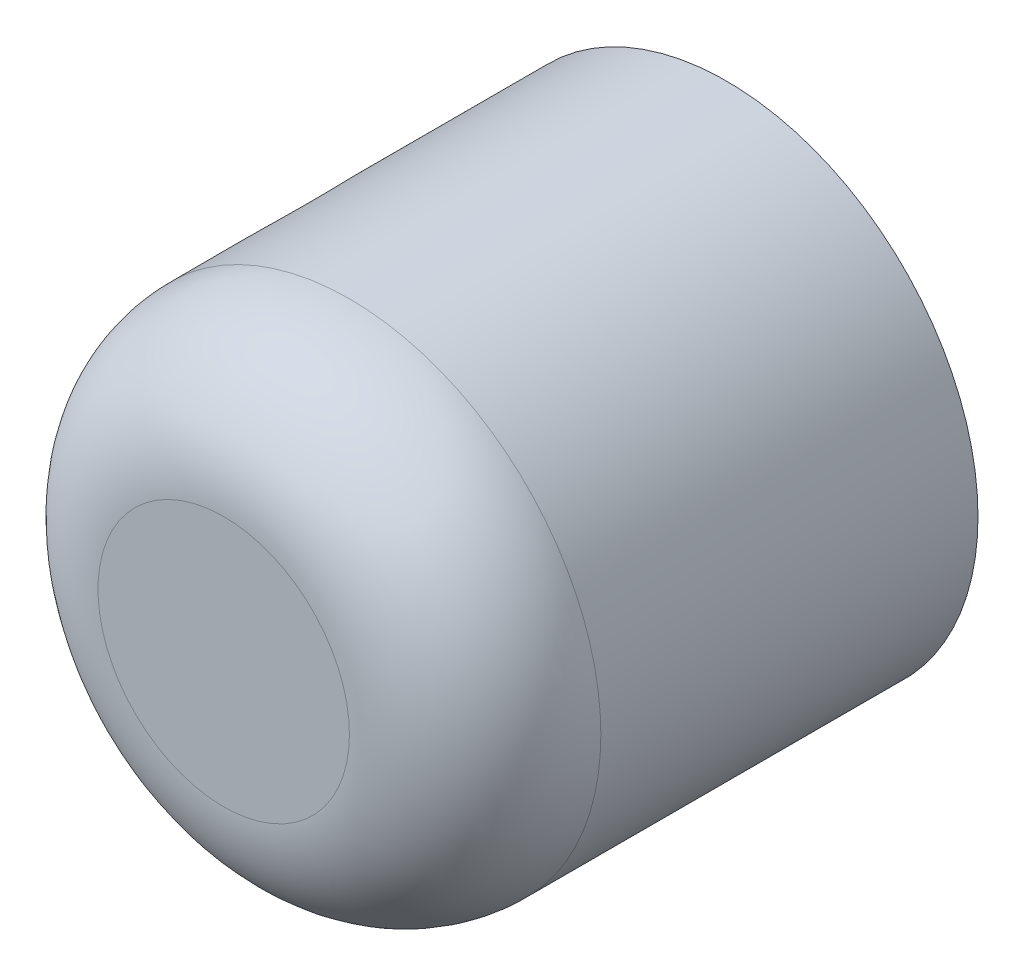
ISO-10303-21;
HEADER;
FILE_DESCRIPTION(('STEP AP214'),'2;1');
FILE_NAME('part.step','',(''),(''),'','','');
FILE_SCHEMA(('AUTOMOTIVE_DESIGN { 1 0 10303 214 1 1 1 1 }'));
ENDSEC;
DATA;
#1=APPLICATION_CONTEXT('core data for automotive mechanical design processes');
#2=APPLICATION_PROTOCOL_DEFINITION('international standard','automotive_design',2000,#1);
#3=PRODUCT_CONTEXT('',#1,'mechanical');
#4=PRODUCT('Part','Part','',(#3));
#5=PRODUCT_RELATED_PRODUCT_CATEGORY('part','',(#4));
#6=PRODUCT_DEFINITION_FORMATION('','',#4);
#7=PRODUCT_DEFINITION_CONTEXT('part definition',#1,'design');
#8=PRODUCT_DEFINITION('design','',#6,#7);
#9=PRODUCT_DEFINITION_SHAPE('','',#8);
#10=(LENGTH_UNIT() NAMED_UNIT(*) SI_UNIT(.MILLI.,.METRE.));
#11=(NAMED_UNIT(*) PLANE_ANGLE_UNIT() SI_UNIT($,.RADIAN.));
#12=(NAMED_UNIT(*) SI_UNIT($,.STERADIAN.) SOLID_ANGLE_UNIT());
#13=UNCERTAINTY_MEASURE_WITH_UNIT(LENGTH_MEASURE(1.E-05),#10,'distance_accuracy_value','');
#14=(GEOMETRIC_REPRESENTATION_CONTEXT(3) GLOBAL_UNCERTAINTY_ASSIGNED_CONTEXT((#13)) GLOBAL_UNIT_ASSIGNED_CONTEXT((#10,
#11,#12)) REPRESENTATION_CONTEXT('',''));
#15=CARTESIAN_POINT('',(0.,0.,0.));
#16=DIRECTION('',(0.,0.,1.));
#17=DIRECTION('',(1.,0.,0.));
#18=AXIS2_PLACEMENT_3D('',#15,#16,#17);
#19=CARTESIAN_POINT('',(0.,0.,40.));
#20=DIRECTION('',(0.,0.,-1.));
#21=DIRECTION('',(-1.,0.,0.));
#22=AXIS2_PLACEMENT_3D('',#19,#20,#21);
#23=CYLINDRICAL_SURFACE('',#22,20.);
#24=CARTESIAN_POINT('',(-20.,0.,35.));
#25=CARTESIAN_POINT('',(-19.9999965113585,-0.366296710163618,34.9999963861018));
#26=CARTESIAN_POINT('',(-19.9899124697988,-0.73268511370783,34.98655812869));
#27=CARTESIAN_POINT('',(-19.9498028267592,-1.4625693522162,34.9330150293369));
#28=CARTESIAN_POINT('',(-19.9197652929413,-1.82606332458207,34.8928942310195));
#29=CARTESIAN_POINT('',(-19.8403721409698,-2.54789047278738,34.7865351565315));
#30=CARTESIAN_POINT('',(-19.7909741133563,-2.90621051616155,34.720239541654));
#31=CARTESIAN_POINT('',(-19.6740035453481,-3.61418352045056,34.562596072455));
#32=CARTESIAN_POINT('',(-19.6064334661858,-3.96383764808261,34.4712516107299));
#33=CARTESIAN_POINT('',(-19.4550358114748,-4.65019870405072,34.2654563138477));
#34=CARTESIAN_POINT('',(-19.3713101078236,-4.98697169460707,34.1511500914871));
#35=CARTESIAN_POINT('',(-19.1889861174222,-5.64804382127004,33.9005244570771));
#36=CARTESIAN_POINT('',(-19.0903873713562,-5.97234257175351,33.7642043651767));
#37=CARTESIAN_POINT('',(-18.8801566621205,-6.60691757737375,33.4711075316996));
#38=CARTESIAN_POINT('',(-18.7685314958907,-6.91720102923096,33.3143414534741));
#39=CARTESIAN_POINT('',(-18.5340437983215,-7.52294704576765,32.9817062263669));
#40=CARTESIAN_POINT('',(-18.4111796328447,-7.81840744549117,32.8058342988174));
#41=CARTESIAN_POINT('',(-18.1443031175184,-8.42035871330148,32.4192221834676));
#42=CARTESIAN_POINT('',(-17.999385792139,-8.72534255680653,32.2067615227093));
#43=CARTESIAN_POINT('',(-17.700864243315,-9.3160583701875,31.7621319142987));
#44=CARTESIAN_POINT('',(-17.5472595569454,-9.60178931234915,31.5299619160602));
#45=CARTESIAN_POINT('',(-17.2336413464221,-10.1539423249443,31.0468196925549));
#46=CARTESIAN_POINT('',(-17.0736191230106,-10.4203367088996,30.7958215143586));
#47=CARTESIAN_POINT('',(-16.7499388406896,-10.9330453810883,30.2762707719534));
#48=CARTESIAN_POINT('',(-16.5862804954093,-11.1793580805595,30.0077168218424));
#49=CARTESIAN_POINT('',(-16.2246453787696,-11.6995959606449,29.3974101271187));
#50=CARTESIAN_POINT('',(-16.0264558262692,-11.9689544134961,29.0518756523176));
#51=CARTESIAN_POINT('',(-15.6338343579305,-12.4774364346866,28.3370281236322));
#52=CARTESIAN_POINT('',(-15.4394035900827,-12.7165508858755,27.9677079498692));
#53=CARTESIAN_POINT('',(-15.0604959900272,-13.1630960539542,27.2060811091688));
#54=CARTESIAN_POINT('',(-14.8760093297304,-13.3705584392365,26.8137979682047));
#55=CARTESIAN_POINT('',(-14.5238817554465,-13.7522438550023,26.0062486739795));
#56=CARTESIAN_POINT('',(-14.3562312769943,-13.9264858088129,25.5909957799394));
#57=CARTESIAN_POINT('',(-14.0994098818598,-14.1854714289842,24.8847964320805));
#58=CARTESIAN_POINT('',(-14.0030661734723,-14.2803956915913,24.6001626044615));
#59=CARTESIAN_POINT('',(-13.8238821501401,-14.4539208481076,24.0218471974313));
#60=CARTESIAN_POINT('',(-13.7410375043205,-14.5325269795539,23.7281685559441));
#61=CARTESIAN_POINT('',(-13.5916939245169,-14.6722978375215,23.1331875647449));
#62=CARTESIAN_POINT('',(-13.52516442822,-14.7334952099184,22.8319006537427));
#63=CARTESIAN_POINT('',(-13.4108404866216,-14.8376332643469,22.2226379760121));
#64=CARTESIAN_POINT('',(-13.3630458091083,-14.8805741726617,21.9146622922386));
#65=CARTESIAN_POINT('',(-13.2879911024328,-14.9476378467989,21.2912346894291));
#66=CARTESIAN_POINT('',(-13.2609242839453,-14.9715836254161,20.975740035297));
#67=CARTESIAN_POINT('',(-13.2294204748664,-14.9994296156091,20.3427307862984));
#68=CARTESIAN_POINT('',(-13.2249828633469,-15.0033303772047,20.0252162470954));
#69=CARTESIAN_POINT('',(-13.2389702614917,-14.990988834967,19.3909901129164));
#70=CARTESIAN_POINT('',(-13.2574027537373,-14.9747399386217,19.0742788147213));
#71=CARTESIAN_POINT('',(-13.3161951043303,-14.9224822900343,18.4445716509627));
#72=CARTESIAN_POINT('',(-13.3565551860809,-14.8864733364722,18.1315758232866));
#73=CARTESIAN_POINT('',(-13.451860574532,-14.8003740567364,17.5449746659284));
#74=CARTESIAN_POINT('',(-13.5047743077494,-14.7522110272835,17.2707486215373));
#75=CARTESIAN_POINT('',(-13.6247493624364,-14.6414778438523,16.7283302331093));
#76=CARTESIAN_POINT('',(-13.6918157382138,-14.5789025421133,16.4601400826284));
#77=CARTESIAN_POINT('',(-13.9113732641912,-14.3706061370593,15.6658065485882));
#78=CARTESIAN_POINT('',(-14.08221377887,-14.2043223249582,15.1499517200444));
#79=CARTESIAN_POINT('',(-14.4219895683393,-13.8583376439237,14.2435924779948));
#80=CARTESIAN_POINT('',(-14.585328766178,-13.6869339914174,13.8476627771613));
#81=CARTESIAN_POINT('',(-14.9268415775111,-13.3136549215252,13.0768564183222));
#82=CARTESIAN_POINT('',(-15.1050227777357,-13.1117638766204,12.7019906934911));
#83=CARTESIAN_POINT('',(-15.4703569302188,-12.6786637309853,11.9730673866568));
#84=CARTESIAN_POINT('',(-15.6575277390138,-12.447394639189,11.6190546155009));
#85=CARTESIAN_POINT('',(-16.0352309482054,-11.9568887311489,10.9329955565281));
#86=CARTESIAN_POINT('',(-16.2257628176414,-11.6976562998731,10.6009458377916));
#87=CARTESIAN_POINT('',(-16.6104291012532,-11.1449480040911,9.95128972801059));
#88=CARTESIAN_POINT('',(-16.804533008059,-10.8507727850609,9.63425971088071));
#89=CARTESIAN_POINT('',(-17.1870062538012,-10.2341805850322,9.02505751238437));
#90=CARTESIAN_POINT('',(-17.3753750107174,-9.91176075047375,8.73288784855689));
#91=CARTESIAN_POINT('',(-17.7417864984034,-9.23987019615452,8.17566281048437));
#92=CARTESIAN_POINT('',(-17.9198461668062,-8.89044618484616,7.91056238108999));
#93=CARTESIAN_POINT('',(-18.2618094521956,-8.16498687078224,7.40923901070217));
#94=CARTESIAN_POINT('',(-18.4257166818317,-7.78895840412101,7.17300869369019));
#95=CARTESIAN_POINT('',(-18.7042362742494,-7.08967069369051,6.77637874864873));
#96=CARTESIAN_POINT('',(-18.8221427571289,-6.77094997977293,6.61027203279188));
#97=CARTESIAN_POINT('',(-19.0442292064019,-6.11849819864272,6.29983823547387));
#98=CARTESIAN_POINT('',(-19.1484119954437,-5.7847702370764,6.15550667447371));
#99=CARTESIAN_POINT('',(-19.3410403179391,-5.10385045904808,5.89028184724433));
#100=CARTESIAN_POINT('',(-19.4294917412814,-4.75666374114971,5.76937980737928));
#101=CARTESIAN_POINT('',(-19.5888606649666,-4.05061594679502,5.55254800326136));
#102=CARTESIAN_POINT('',(-19.6597779401237,-3.69175472047356,5.45661855972301));
#103=CARTESIAN_POINT('',(-19.7828533643196,-2.96248007986828,5.29066935433549));
#104=CARTESIAN_POINT('',(-19.8348915776636,-2.59200851086627,5.22081516616099));
#105=CARTESIAN_POINT('',(-19.9183084655649,-1.84455393355445,5.10904978735074));
#106=CARTESIAN_POINT('',(-19.9496870898162,-1.46757090939162,5.06713866475596));
#107=CARTESIAN_POINT('',(-19.9909711060942,-0.710460994449018,5.01202951047725));
#108=CARTESIAN_POINT('',(-20.0008836588341,-0.330335194533561,4.99882190378739));
#109=CARTESIAN_POINT('',(-19.9989928040336,0.429748272510507,5.0013428125961));
#110=CARTESIAN_POINT('',(-19.9871911076821,0.809705950527777,5.01706904796664));
#111=CARTESIAN_POINT('',(-19.9444619391891,1.52792655367742,5.07412084249463));
#112=CARTESIAN_POINT('',(-19.9155804421033,1.86653464158129,5.11270863058171));
#113=CARTESIAN_POINT('',(-19.8411238052143,2.53851557310385,5.2124614186269));
#114=CARTESIAN_POINT('',(-19.7955499975698,2.87188883228358,5.27362461691836));
#115=CARTESIAN_POINT('',(-19.6886063009364,3.53134483675875,5.41769751118482));
#116=CARTESIAN_POINT('',(-19.6272343035173,3.85742660261147,5.50061010986813));
#117=CARTESIAN_POINT('',(-19.4898460138371,4.50044558160439,5.68713602907308));
#118=CARTESIAN_POINT('',(-19.4138289898009,4.81738233688122,5.79075038401885));
#119=CARTESIAN_POINT('',(-19.2455679667686,5.45155899083037,6.02150439553691));
#120=CARTESIAN_POINT('',(-19.1528471003699,5.76841713391079,6.14934356043656));
#121=CARTESIAN_POINT('',(-18.95473857826,6.38937517170266,6.42460885238541));
#122=CARTESIAN_POINT('',(-18.8493507757809,6.69347491853138,6.57203520638752));
#123=CARTESIAN_POINT('',(-18.6275900230004,7.28790228101033,6.88514859705944));
#124=CARTESIAN_POINT('',(-18.511217720697,7.57823070754258,7.05083455665433));
#125=CARTESIAN_POINT('',(-18.2691793890051,8.14444045419301,7.39926110796053));
#126=CARTESIAN_POINT('',(-18.1435120247071,8.42031968943607,7.58200415031425));
#127=CARTESIAN_POINT('',(-17.8629913590887,9.00191272968238,7.9952842794428));
#128=CARTESIAN_POINT('',(-17.706768141165,9.30491784724094,8.22870707449231));
#129=CARTESIAN_POINT('',(-17.3867762785783,9.88995490736516,8.7157760164888));
#130=CARTESIAN_POINT('',(-17.2230069005929,10.1719848046047,8.96942413065379));
#131=CARTESIAN_POINT('',(-16.8903956812169,10.7152305354898,9.49631860365796));
#132=CARTESIAN_POINT('',(-16.7215439195089,10.9764014641743,9.76960495950908));
#133=CARTESIAN_POINT('',(-16.3820599001873,11.4769148644946,10.3344510857808));
#134=CARTESIAN_POINT('',(-16.2114275358094,11.7162560187469,10.626011957243));
#135=CARTESIAN_POINT('',(-15.8392270080231,12.2161163072519,11.2840261763409));
#136=CARTESIAN_POINT('',(-15.6379471712036,12.4720060810915,11.6541770721972));
#137=CARTESIAN_POINT('',(-15.2433717262861,12.9512931399187,12.4192458705582));
#138=CARTESIAN_POINT('',(-15.0500790702708,13.1746784867536,12.8141727969163));
#139=CARTESIAN_POINT('',(-14.6791792296122,13.5866966921134,13.6274792379806));
#140=CARTESIAN_POINT('',(-14.5015357015214,13.7754112401626,14.0458005150386));
#141=CARTESIAN_POINT('',(-14.1700761498936,14.1161407750965,14.9060626864909));
#142=CARTESIAN_POINT('',(-14.0162404102878,14.2681861878875,15.3479836247524));
#143=CARTESIAN_POINT('',(-13.7955307076944,14.4809148190056,16.0774732685));
#144=CARTESIAN_POINT('',(-13.7181020336498,14.554134511169,16.3582429495813));
#145=CARTESIAN_POINT('',(-13.5781842541643,14.6847566256776,16.9270533987142));
#146=CARTESIAN_POINT('',(-13.515689892527,14.7421646141092,17.2150915690112));
#147=CARTESIAN_POINT('',(-13.4079554575029,14.8402173216578,17.7966542918508));
#148=CARTESIAN_POINT('',(-13.3626835147548,14.8808930146433,18.0901676460801));
#149=CARTESIAN_POINT('',(-13.2910731986312,14.9448886700652,18.6814044243348));
#150=CARTESIAN_POINT('',(-13.2647348730946,14.9682085886494,18.9791278589957));
#151=CARTESIAN_POINT('',(-13.2320878544489,14.9970777522049,19.5780912287988));
#152=CARTESIAN_POINT('',(-13.2258831487195,15.0025347388557,19.8793413805544));
#153=CARTESIAN_POINT('',(-13.2340882051513,14.9952971170945,20.4813301347754));
#154=CARTESIAN_POINT('',(-13.2484975340893,14.9826028901471,20.7820687478583));
#155=CARTESIAN_POINT('',(-13.2972856276228,14.9393187777796,21.3809393033102));
#156=CARTESIAN_POINT('',(-13.3316865686668,14.9087090186107,21.6790679771145));
#157=CARTESIAN_POINT('',(-13.4189661186323,14.8301978344873,22.2702888307957));
#158=CARTESIAN_POINT('',(-13.471847306982,14.7822939956359,22.5633803015971));
#159=CARTESIAN_POINT('',(-13.6073586456863,14.6577625930383,23.2061262778551));
#160=CARTESIAN_POINT('',(-13.6939620294698,14.5771485679694,23.5541710733321));
#161=CARTESIAN_POINT('',(-13.8872689445213,14.3931068320893,24.238408865856));
#162=CARTESIAN_POINT('',(-13.9939775225763,14.2896733920533,24.5745988619133));
#163=CARTESIAN_POINT('',(-14.2234447986752,14.0612891588136,25.2347295047083));
#164=CARTESIAN_POINT('',(-14.3462362792923,13.9362942461909,25.5586433407156));
#165=CARTESIAN_POINT('',(-14.6037448802101,13.6662163439398,26.1930122501317));
#166=CARTESIAN_POINT('',(-14.7384627118354,13.5211321558329,26.5034665191228));
#167=CARTESIAN_POINT('',(-15.0645505634901,13.1581772274703,27.2161712144129));
#168=CARTESIAN_POINT('',(-15.259358996562,12.9325179785343,27.6128979273366));
#169=CARTESIAN_POINT('',(-15.6569759463732,12.4481879576895,28.3814687755807));
#170=CARTESIAN_POINT('',(-15.8597869421427,12.1895068999429,28.753305102642));
#171=CARTESIAN_POINT('',(-16.2673735735095,11.6400033192313,29.4717996371589));
#172=CARTESIAN_POINT('',(-16.4721505741862,11.3491567269948,29.8184386637755));
#173=CARTESIAN_POINT('',(-16.8780523032832,10.7362223288596,30.4851578641674));
#174=CARTESIAN_POINT('',(-17.0791774720546,10.4141383197855,30.8052412569561));
#175=CARTESIAN_POINT('',(-17.4744480949174,9.73646889227417,31.4198131444702));
#176=CARTESIAN_POINT('',(-17.6685206581782,9.38062459890666,31.7140638481727));
#177=CARTESIAN_POINT('',(-18.0429641977851,8.63852769481245,32.2715599836917));
#178=CARTESIAN_POINT('',(-18.2233333815719,8.2522711192218,32.5348013616036));
#179=CARTESIAN_POINT('',(-18.5651250711443,7.45152859315463,33.0267063300182));
#180=CARTESIAN_POINT('',(-18.7265833500177,7.03709836526211,33.2554354504901));
#181=CARTESIAN_POINT('',(-19.0260894314986,6.18166474352219,33.6752961054856));
#182=CARTESIAN_POINT('',(-19.1641493108967,5.74067521820995,33.8664470437163));
#183=CARTESIAN_POINT('',(-19.3759218048698,4.96827991948146,34.1574408661928));
#184=CARTESIAN_POINT('',(-19.4566336085237,4.64264489136026,34.2676240702741));
#185=CARTESIAN_POINT('',(-19.6026380017657,3.98135077661168,34.4660965159129));
#186=CARTESIAN_POINT('',(-19.6679312761819,3.64569213593847,34.5543867298763));
#187=CARTESIAN_POINT('',(-19.7816563682681,2.96717677702062,34.707704195862));
#188=CARTESIAN_POINT('',(-19.830128800453,2.62433954639907,34.7727874924225));
#189=CARTESIAN_POINT('',(-19.9093971131924,1.93308080582179,34.879023916524));
#190=CARTESIAN_POINT('',(-19.9402020331577,1.58466224547005,34.9201892815832));
#191=CARTESIAN_POINT('',(-19.9745350380319,1.02967181403153,34.9660336037347));
#192=CARTESIAN_POINT('',(-19.9840758558928,0.824089922527921,34.9787623050339));
#193=CARTESIAN_POINT('',(-19.9968098296754,0.412348430359389,34.9957472022458));
#194=CARTESIAN_POINT('',(-20.0000019637594,0.206188742043032,35.0000020342665));
#195=CARTESIAN_POINT('',(-20.,0.,35.));
#196=B_SPLINE_CURVE_WITH_KNOTS('',3,(#24,#25,#26,#27,#28,#29,#30,#31,#32,#33,#34,#35,#36,#37,
#38,#39,#40,#41,#42,#43,#44,#45,#46,#47,#48,#49,#50,#51,#52,#53,#54,#55,#56,#57,#58,#59,#60,#61,
#62,#63,#64,#65,#66,#67,#68,#69,#70,#71,#72,#73,#74,#75,#76,#77,#78,#79,#80,#81,#82,#83,#84,#85,
#86,#87,#88,#89,#90,#91,#92,#93,#94,#95,#96,#97,#98,#99,#100,#101,#102,#103,#104,#105,#106,#107,
#108,#109,#110,#111,#112,#113,#114,#115,#116,#117,#118,#119,#120,#121,#122,#123,#124,#125,#126,
#127,#128,#129,#130,#131,#132,#133,#134,#135,#136,#137,#138,#139,#140,#141,#142,#143,#144,#145,
#146,#147,#148,#149,#150,#151,#152,#153,#154,#155,#156,#157,#158,#159,#160,#161,#162,#163,#164,
#165,#166,#167,#168,#169,#170,#171,#172,#173,#174,#175,#176,#177,#178,#179,#180,#181,#182,#183,
#184,#185,#186,#187,#188,#189,#190,#191,#192,#193,#194,#195),.UNSPECIFIED.,.T.,.F.,(4,2,2,2,2,2,
2,2,2,2,2,2,2,2,2,2,2,2,2,2,2,2,2,2,2,2,2,2,2,2,2,2,2,2,2,2,2,2,2,2,2,2,2,2,2,2,2,2,2,2,2,2,2,2,
2,2,2,2,2,2,2,2,2,2,2,2,2,2,2,2,2,2,2,2,2,2,2,2,2,2,2,2,2,2,2,4),(0.,1.09866762079267,
2.19799284522662,3.29973973979722,4.40133748825806,5.4962034387459,6.59110320828025,
7.68543421291063,8.77992458567114,9.9756380032799,11.1714151972416,12.3688720701053,
13.5664235880107,15.0074376942276,16.4488851686228,17.8888808584492,19.3280538178256,
20.2727344211284,21.217111345304,22.1597054677171,23.1022879066258,24.0535529568912,
25.0047919050381,25.9563421591672,26.9079021080907,27.757281849716,28.6069654437161,
30.3064901875093,31.6888011069915,33.0718230049712,34.457715905249,35.8433917968969,
37.2640550033053,38.6848619055358,40.1032640295064,41.5213030052671,42.6549915960051,
43.78844664777,44.9214764317701,46.0545207661671,47.1946420684713,48.3347661469444,
49.4745098409525,50.6141637214396,51.6390367302544,52.6638279651214,53.6887560398445,
54.7137353409271,55.7747812869417,56.8358395281586,57.8968352144569,58.9579835725294,
60.1962937050032,61.4347244291207,62.6757531372164,63.916856689437,65.3940003201182,
66.8716851107667,68.3458423110593,69.8187721008064,70.7189645466717,71.6188396977134,
72.5170414726716,73.4152455170777,74.3180813390029,75.2208981872707,76.1247184359807,
77.0286648881598,78.1298184403249,79.2312487721671,80.3349601981369,81.4387374973004,
82.925485276308,84.4126972919238,85.9010298068892,87.3891816451833,88.889843990364,
90.3907023025986,91.8886740023136,93.3858701724371,94.4441839950097,95.5024508027576,
96.5581443126356,97.6132972042321,98.2316386637753,98.8500796389985),.UNSPECIFIED.);
#197=CARTESIAN_POINT('',(-16.583123951777,-11.180339887499,30.));
#198=VERTEX_POINT('',#197);
#199=CARTESIAN_POINT('',(-16.583123951777,11.180339887499,30.));
#200=VERTEX_POINT('',#199);
#201=EDGE_CURVE('E65',#198,#200,#196,.T.);
#202=ORIENTED_EDGE('',*,*,#201,.T.);
#203=CARTESIAN_POINT('',(0.,0.,30.));
#204=DIRECTION('',(0.,0.,1.));
#205=DIRECTION('',(1.,0.,0.));
#206=AXIS2_PLACEMENT_3D('',#203,#204,#205);
#207=CIRCLE('',#206,20.);
#208=EDGE_CURVE('E53',#200,#198,#207,.F.);
#209=ORIENTED_EDGE('',*,*,#208,.T.);
#210=EDGE_LOOP('',(#202,#209));
#211=FACE_BOUND('',#210,.T.);
#212=CARTESIAN_POINT('',(0.,0.,0.));
#213=DIRECTION('',(0.,0.,1.));
#214=DIRECTION('',(1.,0.,0.));
#215=AXIS2_PLACEMENT_3D('',#212,#213,#214);
#216=CIRCLE('',#215,20.);
#217=CARTESIAN_POINT('',(20.,0.,0.));
#218=VERTEX_POINT('',#217);
#219=EDGE_CURVE('E68',#218,#218,#216,.T.);
#220=ORIENTED_EDGE('',*,*,#219,.T.);
#221=EDGE_LOOP('',(#220));
#222=FACE_BOUND('',#221,.T.);
#223=ADVANCED_FACE('F39',(#211,#222),#23,.T.);
#224=CARTESIAN_POINT('',(0.,0.,40.));
#225=DIRECTION('',(0.,0.,1.));
#226=DIRECTION('',(1.,0.,0.));
#227=AXIS2_PLACEMENT_3D('',#224,#225,#226);
#228=PLANE('',#227);
#229=CARTESIAN_POINT('',(0.,0.,40.));
#230=DIRECTION('',(0.,0.,1.));
#231=DIRECTION('',(1.,0.,0.));
#232=AXIS2_PLACEMENT_3D('',#229,#230,#231);
#233=CIRCLE('',#232,10.);
#234=CARTESIAN_POINT('',(10.,0.,40.));
#235=VERTEX_POINT('',#234);
#236=EDGE_CURVE('E66',#235,#235,#233,.T.);
#237=ORIENTED_EDGE('',*,*,#236,.T.);
#238=EDGE_LOOP('',(#237));
#239=FACE_BOUND('',#238,.T.);
#240=ADVANCED_FACE('F88',(#239),#228,.T.);
#241=CARTESIAN_POINT('',(0.,0.,0.));
#242=DIRECTION('',(0.,0.,1.));
#243=DIRECTION('',(1.,0.,0.));
#244=AXIS2_PLACEMENT_3D('',#241,#242,#243);
#245=PLANE('',#244);
#246=ORIENTED_EDGE('',*,*,#219,.F.);
#247=EDGE_LOOP('',(#246));
#248=FACE_BOUND('',#247,.T.);
#249=ADVANCED_FACE('F86',(#248),#245,.F.);
#250=CARTESIAN_POINT('',(5.,0.,20.));
#251=DIRECTION('',(-1.,0.,0.));
#252=DIRECTION('',(0.,0.,1.));
#253=AXIS2_PLACEMENT_3D('',#250,#251,#252);
#254=CYLINDRICAL_SURFACE('',#253,15.);
#255=CARTESIAN_POINT('',(5.,0.,20.));
#256=DIRECTION('',(-1.,0.,0.));
#257=DIRECTION('',(0.,0.,1.));
#258=AXIS2_PLACEMENT_3D('',#255,#256,#257);
#259=CIRCLE('',#258,15.);
#260=CARTESIAN_POINT('',(5.,0.,35.));
#261=VERTEX_POINT('',#260);
#262=EDGE_CURVE('E73',#261,#261,#259,.T.);
#263=ORIENTED_EDGE('',*,*,#262,.F.);
#264=EDGE_LOOP('',(#263));
#265=FACE_BOUND('',#264,.T.);
#266=ORIENTED_EDGE('',*,*,#201,.F.);
#267=CARTESIAN_POINT('',(-16.583123951777,-11.180339887499,30.));
#268=CARTESIAN_POINT('',(-16.6711222673378,-11.0498344570783,30.1459251611829));
#269=CARTESIAN_POINT('',(-16.755641626906,-10.9154174756912,30.2904436148217));
#270=CARTESIAN_POINT('',(-16.9178781535794,-10.6389864918652,30.5759808419318));
#271=CARTESIAN_POINT('',(-16.9955955366748,-10.4969727308856,30.7169997264266));
#272=CARTESIAN_POINT('',(-17.1443587665046,-10.205625944743,30.9948037010465));
#273=CARTESIAN_POINT('',(-17.2154073471564,-10.056295957463,31.1315905105834));
#274=CARTESIAN_POINT('',(-17.3510621575231,-9.75056906585469,31.4003445582924));
#275=CARTESIAN_POINT('',(-17.4156684034407,-9.59417217930127,31.5323118085853));
#276=CARTESIAN_POINT('',(-17.5993687221089,-9.116880428914,31.9184331585884));
#277=CARTESIAN_POINT('',(-17.7093306230141,-8.78593222924776,32.1646760235847));
#278=CARTESIAN_POINT('',(-17.9067611397798,-8.10030404692347,32.6315943493657));
#279=CARTESIAN_POINT('',(-17.9942319779576,-7.74562641331244,32.8522723350032));
#280=CARTESIAN_POINT('',(-18.138238716734,-7.06726784174748,33.2356873300377));
#281=CARTESIAN_POINT('',(-18.1973975694117,-6.74626918764503,33.4022066264728));
#282=CARTESIAN_POINT('',(-18.302634425574,-6.09134476513071,33.7122852183454));
#283=CARTESIAN_POINT('',(-18.348713743216,-5.75742029926489,33.8558468198086));
#284=CARTESIAN_POINT('',(-18.4295296833732,-5.07865485669541,34.1187751663084));
#285=CARTESIAN_POINT('',(-18.4642602532943,-4.73380816205987,34.2381289878532));
#286=CARTESIAN_POINT('',(-18.5239955400076,-4.03554961821652,34.4515619153943));
#287=CARTESIAN_POINT('',(-18.5489996365216,-3.68213722428173,34.5456394093462));
#288=CARTESIAN_POINT('',(-18.5921740029549,-2.94462341095923,34.7133192529524));
#289=CARTESIAN_POINT('',(-18.6097629985668,-2.5600709410411,34.7850911733506));
#290=CARTESIAN_POINT('',(-18.6369378704012,-1.7862561206049,34.8983965104567));
#291=CARTESIAN_POINT('',(-18.646523441386,-1.39699359102715,34.9399287738658));
#292=CARTESIAN_POINT('',(-18.6585716609455,-0.61611638487246,34.9924514899222));
#293=CARTESIAN_POINT('',(-18.6610308951247,-0.224500670842133,35.003427302157));
#294=CARTESIAN_POINT('',(-18.6590562930082,0.558374741682461,34.9947147753981));
#295=CARTESIAN_POINT('',(-18.6546223292954,0.949634433462082,34.9750258695834));
#296=CARTESIAN_POINT('',(-18.638057152612,1.74748092264755,34.9034931806819));
#297=CARTESIAN_POINT('',(-18.6255763493735,2.15393078759529,34.8501915420142));
#298=CARTESIAN_POINT('',(-18.5913844957652,2.96075456201216,34.7105931866564));
#299=CARTESIAN_POINT('',(-18.5696730267413,3.36112819504241,34.6242949734341));
#300=CARTESIAN_POINT('',(-18.5152139809863,4.1527954396429,34.4194814961004));
#301=CARTESIAN_POINT('',(-18.482466469229,4.54408910465614,34.3009664216638));
#302=CARTESIAN_POINT('',(-18.4037410160266,5.31451912977319,34.0328974815065));
#303=CARTESIAN_POINT('',(-18.3577639553981,5.69365629738305,33.8833456823794));
#304=CARTESIAN_POINT('',(-18.2510898680216,6.43053889133746,33.5575715127252));
#305=CARTESIAN_POINT('',(-18.1906492854166,6.78853463249152,33.3818319612124));
#306=CARTESIAN_POINT('',(-18.0523953117771,7.48690901389416,33.0039920489506));
#307=CARTESIAN_POINT('',(-17.9745799356868,7.82728563569486,32.8018886772544));
#308=CARTESIAN_POINT('',(-17.7996033809084,8.48700922041913,32.374365685862));
#309=CARTESIAN_POINT('',(-17.7024739242003,8.80638953861243,32.1489845860791));
#310=CARTESIAN_POINT('',(-17.4869705253799,9.42201691951025,31.678000075926));
#311=CARTESIAN_POINT('',(-17.3686083138715,9.71827662677035,31.4324078720683));
#312=CARTESIAN_POINT('',(-17.1424029007371,10.2128011135307,30.9899396308964));
#313=CARTESIAN_POINT('',(-17.0396499939781,10.4167088112013,30.7967276609883));
#314=CARTESIAN_POINT('',(-16.8212147853088,10.8097041267885,30.4032580286636));
#315=CARTESIAN_POINT('',(-16.7055490673117,10.9988102349937,30.2030096246804));
#316=CARTESIAN_POINT('',(-16.583123951777,11.180339887499,30.));
#317=B_SPLINE_CURVE_WITH_KNOTS('',3,(#267,#268,#269,#270,#271,#272,#273,#274,#275,#276,#277,
#278,#279,#280,#281,#282,#283,#284,#285,#286,#287,#288,#289,#290,#291,#292,#293,#294,#295,#296,
#297,#298,#299,#300,#301,#302,#303,#304,#305,#306,#307,#308,#309,#310,#311,#312,#313,#314,#315,
#316),.UNSPECIFIED.,.F.,.F.,(4,2,2,2,2,2,2,2,2,2,2,2,2,2,2,2,2,2,2,2,2,2,2,2,4),(0.,
0.643838940884296,1.28765742987101,1.9312108180016,2.57476258753427,3.85327305972836,
5.13165715511261,6.22976183444362,7.3277561433593,8.42633509018607,9.52498408429289,
10.698443721591,11.8719481106838,13.0460146604131,14.2201029123939,15.4489886377191,
16.6779301047486,17.9068643366221,19.1357167656232,20.3442138719076,21.5528491187122,
22.759515426332,23.9655171205681,24.8621528429909,25.7576499841176),.UNSPECIFIED.);
#318=EDGE_CURVE('E11',#198,#200,#317,.T.);
#319=ORIENTED_EDGE('',*,*,#318,.T.);
#320=EDGE_LOOP('',(#266,#319));
#321=FACE_BOUND('',#320,.T.);
#322=ADVANCED_FACE('F67',(#265,#321),#254,.F.);
#323=CARTESIAN_POINT('',(5.,0.,20.));
#324=DIRECTION('',(-1.,0.,0.));
#325=DIRECTION('',(0.,0.,1.));
#326=AXIS2_PLACEMENT_3D('',#323,#324,#325);
#327=PLANE('',#326);
#328=ORIENTED_EDGE('',*,*,#262,.T.);
#329=EDGE_LOOP('',(#328));
#330=FACE_BOUND('',#329,.T.);
#331=ADVANCED_FACE('F85',(#330),#327,.T.);
#332=CARTESIAN_POINT('',(0.,0.,30.));
#333=DIRECTION('',(0.,0.,1.));
#334=DIRECTION('',(1.,0.,0.));
#335=AXIS2_PLACEMENT_3D('',#332,#333,#334);
#336=DEGENERATE_TOROIDAL_SURFACE('',#335,10.,10.,.T.);
#337=ORIENTED_EDGE('',*,*,#318,.F.);
#338=ORIENTED_EDGE('',*,*,#208,.F.);
#339=EDGE_LOOP('',(#337,#338));
#340=FACE_BOUND('',#339,.T.);
#341=ORIENTED_EDGE('',*,*,#236,.F.);
#342=EDGE_LOOP('',(#341));
#343=FACE_BOUND('',#342,.T.);
#344=ADVANCED_FACE('F41',(#340,#343),#336,.T.);
#345=CLOSED_SHELL('',(#223,#240,#249,#322,#331,#344));
#346=MANIFOLD_SOLID_BREP('B2',#345);
#347=ADVANCED_BREP_SHAPE_REPRESENTATION('',(#18,#346),#14);
#348=SHAPE_DEFINITION_REPRESENTATION(#9,#347);
ENDSEC;
END-ISO-10303-21;
